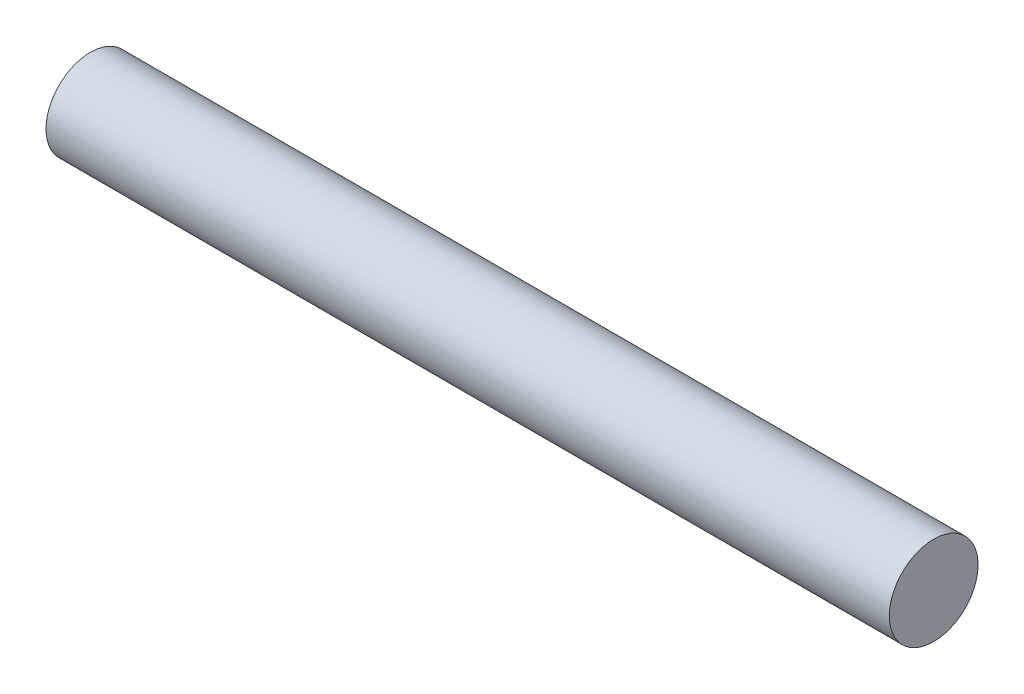
ISO-10303-21;
HEADER;
FILE_DESCRIPTION(('STEP AP214'),'2;1');
FILE_NAME('part.step','',(''),(''),'','','');
FILE_SCHEMA(('AUTOMOTIVE_DESIGN { 1 0 10303 214 1 1 1 1 }'));
ENDSEC;
DATA;
#1=APPLICATION_CONTEXT('core data for automotive mechanical design processes');
#2=APPLICATION_PROTOCOL_DEFINITION('international standard','automotive_design',2000,#1);
#3=PRODUCT_CONTEXT('',#1,'mechanical');
#4=PRODUCT('Part','Part','',(#3));
#5=PRODUCT_RELATED_PRODUCT_CATEGORY('part','',(#4));
#6=PRODUCT_DEFINITION_FORMATION('','',#4);
#7=PRODUCT_DEFINITION_CONTEXT('part definition',#1,'design');
#8=PRODUCT_DEFINITION('design','',#6,#7);
#9=PRODUCT_DEFINITION_SHAPE('','',#8);
#10=(LENGTH_UNIT() NAMED_UNIT(*) SI_UNIT(.MILLI.,.METRE.));
#11=(NAMED_UNIT(*) PLANE_ANGLE_UNIT() SI_UNIT($,.RADIAN.));
#12=(NAMED_UNIT(*) SI_UNIT($,.STERADIAN.) SOLID_ANGLE_UNIT());
#13=UNCERTAINTY_MEASURE_WITH_UNIT(LENGTH_MEASURE(1.E-05),#10,'distance_accuracy_value','');
#14=(GEOMETRIC_REPRESENTATION_CONTEXT(3) GLOBAL_UNCERTAINTY_ASSIGNED_CONTEXT((#13)) GLOBAL_UNIT_ASSIGNED_CONTEXT((#10,
#11,#12)) REPRESENTATION_CONTEXT('',''));
#15=CARTESIAN_POINT('',(0.,0.,0.));
#16=DIRECTION('',(0.,0.,1.));
#17=DIRECTION('',(1.,0.,0.));
#18=AXIS2_PLACEMENT_3D('',#15,#16,#17);
#19=CARTESIAN_POINT('',(0.,0.,0.));
#20=DIRECTION('',(1.,0.,0.));
#21=DIRECTION('',(0.,0.,-1.));
#22=AXIS2_PLACEMENT_3D('',#19,#20,#21);
#23=PLANE('',#22);
#24=CARTESIAN_POINT('',(0.,0.,0.));
#25=DIRECTION('',(-1.,0.,0.));
#26=DIRECTION('',(0.,0.,1.));
#27=AXIS2_PLACEMENT_3D('',#24,#25,#26);
#28=CIRCLE('',#27,6.);
#29=CARTESIAN_POINT('',(0.,0.,6.));
#30=VERTEX_POINT('',#29);
#31=EDGE_CURVE('E10',#30,#30,#28,.T.);
#32=ORIENTED_EDGE('',*,*,#31,.T.);
#33=EDGE_LOOP('',(#32));
#34=FACE_BOUND('',#33,.T.);
#35=ADVANCED_FACE('F43',(#34),#23,.F.);
#36=CARTESIAN_POINT('',(0.,0.,0.));
#37=DIRECTION('',(-1.,0.,0.));
#38=DIRECTION('',(0.,0.,1.));
#39=AXIS2_PLACEMENT_3D('',#36,#37,#38);
#40=CYLINDRICAL_SURFACE('',#39,6.);
#41=ORIENTED_EDGE('',*,*,#31,.F.);
#42=EDGE_LOOP('',(#41));
#43=FACE_BOUND('',#42,.T.);
#44=CARTESIAN_POINT('',(114.,0.,0.));
#45=DIRECTION('',(-1.,0.,0.));
#46=DIRECTION('',(0.,0.,1.));
#47=AXIS2_PLACEMENT_3D('',#44,#45,#46);
#48=CIRCLE('',#47,6.);
#49=CARTESIAN_POINT('',(114.,0.,6.));
#50=VERTEX_POINT('',#49);
#51=EDGE_CURVE('E50',#50,#50,#48,.T.);
#52=ORIENTED_EDGE('',*,*,#51,.T.);
#53=EDGE_LOOP('',(#52));
#54=FACE_BOUND('',#53,.T.);
#55=ADVANCED_FACE('F57',(#43,#54),#40,.T.);
#56=CARTESIAN_POINT('',(114.,6.,0.));
#57=DIRECTION('',(-1.,0.,0.));
#58=DIRECTION('',(0.,0.,1.));
#59=AXIS2_PLACEMENT_3D('',#56,#57,#58);
#60=PLANE('',#59);
#61=ORIENTED_EDGE('',*,*,#51,.F.);
#62=EDGE_LOOP('',(#61));
#63=FACE_BOUND('',#62,.T.);
#64=ADVANCED_FACE('F59',(#63),#60,.F.);
#65=CLOSED_SHELL('',(#35,#55,#64));
#66=MANIFOLD_SOLID_BREP('B2',#65);
#67=ADVANCED_BREP_SHAPE_REPRESENTATION('',(#18,#66),#14);
#68=SHAPE_DEFINITION_REPRESENTATION(#9,#67);
ENDSEC;
END-ISO-10303-21;
